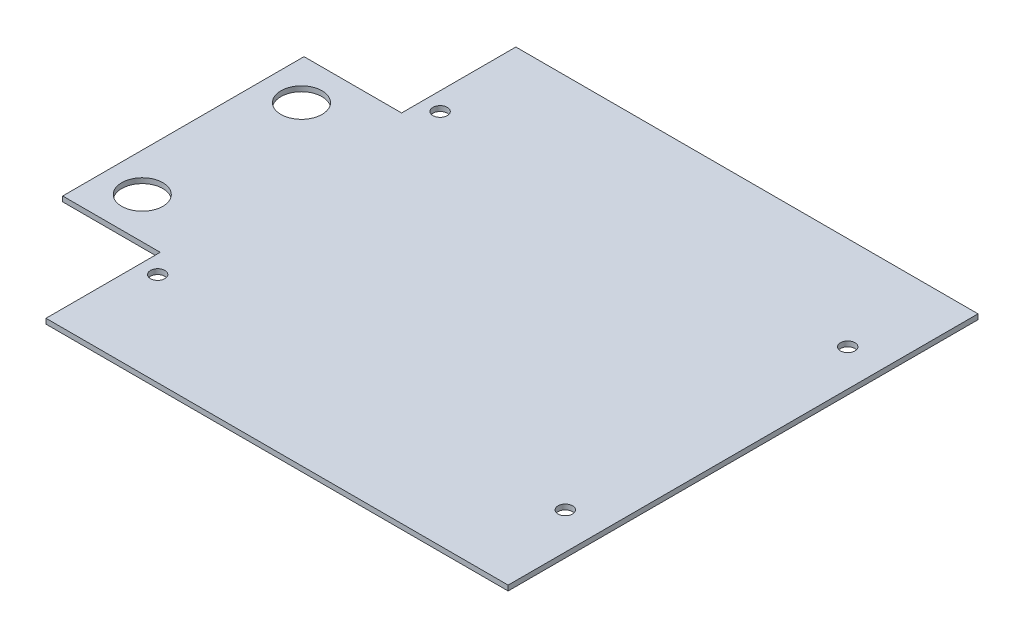
ISO-10303-21;
HEADER;
FILE_DESCRIPTION(('STEP AP214'),'2;1');
FILE_NAME('part.step','',(''),(''),'','','');
FILE_SCHEMA(('AUTOMOTIVE_DESIGN { 1 0 10303 214 1 1 1 1 }'));
ENDSEC;
DATA;
#1=APPLICATION_CONTEXT('core data for automotive mechanical design processes');
#2=APPLICATION_PROTOCOL_DEFINITION('international standard','automotive_design',2000,#1);
#3=PRODUCT_CONTEXT('',#1,'mechanical');
#4=PRODUCT('Part','Part','',(#3));
#5=PRODUCT_RELATED_PRODUCT_CATEGORY('part','',(#4));
#6=PRODUCT_DEFINITION_FORMATION('','',#4);
#7=PRODUCT_DEFINITION_CONTEXT('part definition',#1,'design');
#8=PRODUCT_DEFINITION('design','',#6,#7);
#9=PRODUCT_DEFINITION_SHAPE('','',#8);
#10=(LENGTH_UNIT() NAMED_UNIT(*) SI_UNIT(.MILLI.,.METRE.));
#11=(NAMED_UNIT(*) PLANE_ANGLE_UNIT() SI_UNIT($,.RADIAN.));
#12=(NAMED_UNIT(*) SI_UNIT($,.STERADIAN.) SOLID_ANGLE_UNIT());
#13=UNCERTAINTY_MEASURE_WITH_UNIT(LENGTH_MEASURE(1.E-05),#10,'distance_accuracy_value','');
#14=(GEOMETRIC_REPRESENTATION_CONTEXT(3) GLOBAL_UNCERTAINTY_ASSIGNED_CONTEXT((#13)) GLOBAL_UNIT_ASSIGNED_CONTEXT((#10,
#11,#12)) REPRESENTATION_CONTEXT('',''));
#15=CARTESIAN_POINT('',(0.,0.,0.));
#16=DIRECTION('',(0.,0.,1.));
#17=DIRECTION('',(1.,0.,0.));
#18=AXIS2_PLACEMENT_3D('',#15,#16,#17);
#19=CARTESIAN_POINT('',(90.,-2.,-91.5));
#20=DIRECTION('',(1.,0.,0.));
#21=DIRECTION('',(0.,0.,-1.));
#22=AXIS2_PLACEMENT_3D('',#19,#20,#21);
#23=PLANE('',#22);
#24=DIRECTION('',(0.,0.,-1.));
#25=VECTOR('',#24,1.);
#26=CARTESIAN_POINT('',(90.,0.,-91.5));
#27=LINE('',#26,#25);
#28=CARTESIAN_POINT('',(90.,0.,91.5));
#29=VERTEX_POINT('',#28);
#30=CARTESIAN_POINT('',(90.,0.,-91.5));
#31=VERTEX_POINT('',#30);
#32=EDGE_CURVE('E140',#29,#31,#27,.T.);
#33=ORIENTED_EDGE('',*,*,#32,.F.);
#34=DIRECTION('',(0.,1.,0.));
#35=VECTOR('',#34,1.);
#36=CARTESIAN_POINT('',(90.,-2.,91.5));
#37=LINE('',#36,#35);
#38=CARTESIAN_POINT('',(90.,-2.,91.5));
#39=VERTEX_POINT('',#38);
#40=EDGE_CURVE('E11',#39,#29,#37,.T.);
#41=ORIENTED_EDGE('',*,*,#40,.F.);
#42=DIRECTION('',(0.,0.,-1.));
#43=VECTOR('',#42,1.);
#44=CARTESIAN_POINT('',(90.,-2.,-91.5));
#45=LINE('',#44,#43);
#46=CARTESIAN_POINT('',(90.,-2.,-91.5));
#47=VERTEX_POINT('',#46);
#48=EDGE_CURVE('E161',#39,#47,#45,.T.);
#49=ORIENTED_EDGE('',*,*,#48,.T.);
#50=DIRECTION('',(0.,1.,0.));
#51=VECTOR('',#50,1.);
#52=CARTESIAN_POINT('',(90.,-2.,-91.5));
#53=LINE('',#52,#51);
#54=EDGE_CURVE('E46',#47,#31,#53,.T.);
#55=ORIENTED_EDGE('',*,*,#54,.T.);
#56=EDGE_LOOP('',(#33,#41,#49,#55));
#57=FACE_BOUND('',#56,.T.);
#58=ADVANCED_FACE('F43',(#57),#23,.T.);
#59=CARTESIAN_POINT('',(-90.,-2.,91.5));
#60=DIRECTION('',(0.,0.,1.));
#61=DIRECTION('',(1.,0.,0.));
#62=AXIS2_PLACEMENT_3D('',#59,#60,#61);
#63=PLANE('',#62);
#64=DIRECTION('',(1.,0.,0.));
#65=VECTOR('',#64,1.);
#66=CARTESIAN_POINT('',(-90.,0.,91.5));
#67=LINE('',#66,#65);
#68=CARTESIAN_POINT('',(-90.,0.,91.5));
#69=VERTEX_POINT('',#68);
#70=EDGE_CURVE('E159',#69,#29,#67,.T.);
#71=ORIENTED_EDGE('',*,*,#70,.F.);
#72=DIRECTION('',(0.,1.,0.));
#73=VECTOR('',#72,1.);
#74=CARTESIAN_POINT('',(-90.,-2.,91.5));
#75=LINE('',#74,#73);
#76=CARTESIAN_POINT('',(-90.,-2.,91.5));
#77=VERTEX_POINT('',#76);
#78=EDGE_CURVE('E52',#77,#69,#75,.T.);
#79=ORIENTED_EDGE('',*,*,#78,.F.);
#80=DIRECTION('',(1.,0.,0.));
#81=VECTOR('',#80,1.);
#82=CARTESIAN_POINT('',(-90.,-2.,91.5));
#83=LINE('',#82,#81);
#84=EDGE_CURVE('E130',#77,#39,#83,.T.);
#85=ORIENTED_EDGE('',*,*,#84,.T.);
#86=ORIENTED_EDGE('',*,*,#40,.T.);
#87=EDGE_LOOP('',(#71,#79,#85,#86));
#88=FACE_BOUND('',#87,.T.);
#89=ADVANCED_FACE('F173',(#88),#63,.T.);
#90=CARTESIAN_POINT('',(-90.,-2.,47.));
#91=DIRECTION('',(-1.,0.,0.));
#92=DIRECTION('',(0.,0.,1.));
#93=AXIS2_PLACEMENT_3D('',#90,#91,#92);
#94=PLANE('',#93);
#95=DIRECTION('',(0.,0.,1.));
#96=VECTOR('',#95,1.);
#97=CARTESIAN_POINT('',(-90.,0.,47.));
#98=LINE('',#97,#96);
#99=CARTESIAN_POINT('',(-90.,0.,47.));
#100=VERTEX_POINT('',#99);
#101=EDGE_CURVE('E117',#100,#69,#98,.T.);
#102=ORIENTED_EDGE('',*,*,#101,.F.);
#103=DIRECTION('',(0.,1.,0.));
#104=VECTOR('',#103,1.);
#105=CARTESIAN_POINT('',(-90.,-2.,47.));
#106=LINE('',#105,#104);
#107=CARTESIAN_POINT('',(-90.,-2.,47.));
#108=VERTEX_POINT('',#107);
#109=EDGE_CURVE('E112',#108,#100,#106,.T.);
#110=ORIENTED_EDGE('',*,*,#109,.F.);
#111=DIRECTION('',(0.,0.,1.));
#112=VECTOR('',#111,1.);
#113=CARTESIAN_POINT('',(-90.,-2.,47.));
#114=LINE('',#113,#112);
#115=EDGE_CURVE('E115',#108,#77,#114,.T.);
#116=ORIENTED_EDGE('',*,*,#115,.T.);
#117=ORIENTED_EDGE('',*,*,#78,.T.);
#118=EDGE_LOOP('',(#102,#110,#116,#117));
#119=FACE_BOUND('',#118,.T.);
#120=ADVANCED_FACE('F114',(#119),#94,.T.);
#121=CARTESIAN_POINT('',(-128.,-2.,47.));
#122=DIRECTION('',(0.,0.,1.));
#123=DIRECTION('',(1.,0.,0.));
#124=AXIS2_PLACEMENT_3D('',#121,#122,#123);
#125=PLANE('',#124);
#126=DIRECTION('',(1.,0.,0.));
#127=VECTOR('',#126,1.);
#128=CARTESIAN_POINT('',(-128.,0.,47.));
#129=LINE('',#128,#127);
#130=CARTESIAN_POINT('',(-128.,0.,47.));
#131=VERTEX_POINT('',#130);
#132=EDGE_CURVE('E156',#131,#100,#129,.T.);
#133=ORIENTED_EDGE('',*,*,#132,.F.);
#134=DIRECTION('',(0.,1.,0.));
#135=VECTOR('',#134,1.);
#136=CARTESIAN_POINT('',(-128.,-2.,47.));
#137=LINE('',#136,#135);
#138=CARTESIAN_POINT('',(-128.,-2.,47.));
#139=VERTEX_POINT('',#138);
#140=EDGE_CURVE('E122',#139,#131,#137,.T.);
#141=ORIENTED_EDGE('',*,*,#140,.F.);
#142=DIRECTION('',(1.,0.,0.));
#143=VECTOR('',#142,1.);
#144=CARTESIAN_POINT('',(-128.,-2.,47.));
#145=LINE('',#144,#143);
#146=EDGE_CURVE('E128',#139,#108,#145,.T.);
#147=ORIENTED_EDGE('',*,*,#146,.T.);
#148=ORIENTED_EDGE('',*,*,#109,.T.);
#149=EDGE_LOOP('',(#133,#141,#147,#148));
#150=FACE_BOUND('',#149,.T.);
#151=ADVANCED_FACE('F132',(#150),#125,.T.);
#152=CARTESIAN_POINT('',(-128.,-2.,-47.));
#153=DIRECTION('',(-1.,0.,0.));
#154=DIRECTION('',(0.,0.,1.));
#155=AXIS2_PLACEMENT_3D('',#152,#153,#154);
#156=PLANE('',#155);
#157=DIRECTION('',(0.,0.,1.));
#158=VECTOR('',#157,1.);
#159=CARTESIAN_POINT('',(-128.,0.,-47.));
#160=LINE('',#159,#158);
#161=CARTESIAN_POINT('',(-128.,0.,-47.));
#162=VERTEX_POINT('',#161);
#163=EDGE_CURVE('E153',#162,#131,#160,.T.);
#164=ORIENTED_EDGE('',*,*,#163,.F.);
#165=DIRECTION('',(0.,1.,0.));
#166=VECTOR('',#165,1.);
#167=CARTESIAN_POINT('',(-128.,-2.,-47.));
#168=LINE('',#167,#166);
#169=CARTESIAN_POINT('',(-128.,-2.,-47.));
#170=VERTEX_POINT('',#169);
#171=EDGE_CURVE('E165',#170,#162,#168,.T.);
#172=ORIENTED_EDGE('',*,*,#171,.F.);
#173=DIRECTION('',(0.,0.,1.));
#174=VECTOR('',#173,1.);
#175=CARTESIAN_POINT('',(-128.,-2.,-47.));
#176=LINE('',#175,#174);
#177=EDGE_CURVE('E133',#170,#139,#176,.T.);
#178=ORIENTED_EDGE('',*,*,#177,.T.);
#179=ORIENTED_EDGE('',*,*,#140,.T.);
#180=EDGE_LOOP('',(#164,#172,#178,#179));
#181=FACE_BOUND('',#180,.T.);
#182=ADVANCED_FACE('F186',(#181),#156,.T.);
#183=CARTESIAN_POINT('',(-90.,-2.,-47.));
#184=DIRECTION('',(0.,0.,-1.));
#185=DIRECTION('',(-1.,0.,0.));
#186=AXIS2_PLACEMENT_3D('',#183,#184,#185);
#187=PLANE('',#186);
#188=DIRECTION('',(-1.,0.,0.));
#189=VECTOR('',#188,1.);
#190=CARTESIAN_POINT('',(-90.,0.,-47.));
#191=LINE('',#190,#189);
#192=CARTESIAN_POINT('',(-90.,0.,-47.));
#193=VERTEX_POINT('',#192);
#194=EDGE_CURVE('E150',#193,#162,#191,.T.);
#195=ORIENTED_EDGE('',*,*,#194,.F.);
#196=DIRECTION('',(0.,1.,0.));
#197=VECTOR('',#196,1.);
#198=CARTESIAN_POINT('',(-90.,-2.,-47.));
#199=LINE('',#198,#197);
#200=CARTESIAN_POINT('',(-90.,-2.,-47.));
#201=VERTEX_POINT('',#200);
#202=EDGE_CURVE('E167',#201,#193,#199,.T.);
#203=ORIENTED_EDGE('',*,*,#202,.F.);
#204=DIRECTION('',(-1.,0.,0.));
#205=VECTOR('',#204,1.);
#206=CARTESIAN_POINT('',(-90.,-2.,-47.));
#207=LINE('',#206,#205);
#208=EDGE_CURVE('E135',#201,#170,#207,.T.);
#209=ORIENTED_EDGE('',*,*,#208,.T.);
#210=ORIENTED_EDGE('',*,*,#171,.T.);
#211=EDGE_LOOP('',(#195,#203,#209,#210));
#212=FACE_BOUND('',#211,.T.);
#213=ADVANCED_FACE('F189',(#212),#187,.T.);
#214=CARTESIAN_POINT('',(-90.,-2.,-91.5));
#215=DIRECTION('',(-1.,0.,0.));
#216=DIRECTION('',(0.,0.,1.));
#217=AXIS2_PLACEMENT_3D('',#214,#215,#216);
#218=PLANE('',#217);
#219=DIRECTION('',(0.,0.,1.));
#220=VECTOR('',#219,1.);
#221=CARTESIAN_POINT('',(-90.,0.,-91.5));
#222=LINE('',#221,#220);
#223=CARTESIAN_POINT('',(-90.,0.,-91.5));
#224=VERTEX_POINT('',#223);
#225=EDGE_CURVE('E147',#224,#193,#222,.T.);
#226=ORIENTED_EDGE('',*,*,#225,.F.);
#227=DIRECTION('',(0.,1.,0.));
#228=VECTOR('',#227,1.);
#229=CARTESIAN_POINT('',(-90.,-2.,-91.5));
#230=LINE('',#229,#228);
#231=CARTESIAN_POINT('',(-90.,-2.,-91.5));
#232=VERTEX_POINT('',#231);
#233=EDGE_CURVE('E168',#232,#224,#230,.T.);
#234=ORIENTED_EDGE('',*,*,#233,.F.);
#235=DIRECTION('',(0.,0.,1.));
#236=VECTOR('',#235,1.);
#237=CARTESIAN_POINT('',(-90.,-2.,-91.5));
#238=LINE('',#237,#236);
#239=EDGE_CURVE('E275',#232,#201,#238,.T.);
#240=ORIENTED_EDGE('',*,*,#239,.T.);
#241=ORIENTED_EDGE('',*,*,#202,.T.);
#242=EDGE_LOOP('',(#226,#234,#240,#241));
#243=FACE_BOUND('',#242,.T.);
#244=ADVANCED_FACE('F193',(#243),#218,.T.);
#245=CARTESIAN_POINT('',(-90.,-2.,-91.5));
#246=DIRECTION('',(0.,0.,-1.));
#247=DIRECTION('',(-1.,0.,0.));
#248=AXIS2_PLACEMENT_3D('',#245,#246,#247);
#249=PLANE('',#248);
#250=DIRECTION('',(-1.,0.,0.));
#251=VECTOR('',#250,1.);
#252=CARTESIAN_POINT('',(-90.,0.,-91.5));
#253=LINE('',#252,#251);
#254=EDGE_CURVE('E143',#31,#224,#253,.T.);
#255=ORIENTED_EDGE('',*,*,#254,.F.);
#256=ORIENTED_EDGE('',*,*,#54,.F.);
#257=DIRECTION('',(-1.,0.,0.));
#258=VECTOR('',#257,1.);
#259=CARTESIAN_POINT('',(-90.,-2.,-91.5));
#260=LINE('',#259,#258);
#261=EDGE_CURVE('E273',#47,#232,#260,.T.);
#262=ORIENTED_EDGE('',*,*,#261,.T.);
#263=ORIENTED_EDGE('',*,*,#233,.T.);
#264=EDGE_LOOP('',(#255,#256,#262,#263));
#265=FACE_BOUND('',#264,.T.);
#266=ADVANCED_FACE('F170',(#265),#249,.T.);
#267=CARTESIAN_POINT('',(0.,-2.,0.));
#268=DIRECTION('',(0.,1.,0.));
#269=DIRECTION('',(0.,0.,1.));
#270=AXIS2_PLACEMENT_3D('',#267,#268,#269);
#271=PLANE('',#270);
#272=CARTESIAN_POINT('',(-113.,-2.,31.));
#273=DIRECTION('',(0.,1.,0.));
#274=DIRECTION('',(0.,0.,1.));
#275=AXIS2_PLACEMENT_3D('',#272,#273,#274);
#276=CIRCLE('',#275,8.00000000000001);
#277=CARTESIAN_POINT('',(-113.,-2.,39.));
#278=VERTEX_POINT('',#277);
#279=EDGE_CURVE('E236',#278,#278,#276,.T.);
#280=ORIENTED_EDGE('',*,*,#279,.T.);
#281=EDGE_LOOP('',(#280));
#282=FACE_BOUND('',#281,.T.);
#283=CARTESIAN_POINT('',(-113.,-2.,-31.));
#284=DIRECTION('',(0.,1.,0.));
#285=DIRECTION('',(0.,0.,1.));
#286=AXIS2_PLACEMENT_3D('',#283,#284,#285);
#287=CIRCLE('',#286,8.00000000000001);
#288=CARTESIAN_POINT('',(-113.,-2.,-23.));
#289=VERTEX_POINT('',#288);
#290=EDGE_CURVE('E244',#289,#289,#287,.T.);
#291=ORIENTED_EDGE('',*,*,#290,.T.);
#292=EDGE_LOOP('',(#291));
#293=FACE_BOUND('',#292,.T.);
#294=CARTESIAN_POINT('',(75.76,-2.,-55.0037));
#295=DIRECTION('',(0.,1.,0.));
#296=DIRECTION('',(0.,0.,1.));
#297=AXIS2_PLACEMENT_3D('',#294,#295,#296);
#298=CIRCLE('',#297,2.79999999999999);
#299=CARTESIAN_POINT('',(75.76,-2.,-52.2037));
#300=VERTEX_POINT('',#299);
#301=EDGE_CURVE('E250',#300,#300,#298,.T.);
#302=ORIENTED_EDGE('',*,*,#301,.T.);
#303=EDGE_LOOP('',(#302));
#304=FACE_BOUND('',#303,.T.);
#305=CARTESIAN_POINT('',(75.76,-2.,55.0037));
#306=DIRECTION('',(0.,1.,0.));
#307=DIRECTION('',(0.,0.,1.));
#308=AXIS2_PLACEMENT_3D('',#305,#306,#307);
#309=CIRCLE('',#308,2.79999999999999);
#310=CARTESIAN_POINT('',(75.76,-2.,57.8037));
#311=VERTEX_POINT('',#310);
#312=EDGE_CURVE('E256',#311,#311,#309,.T.);
#313=ORIENTED_EDGE('',*,*,#312,.T.);
#314=EDGE_LOOP('',(#313));
#315=FACE_BOUND('',#314,.T.);
#316=CARTESIAN_POINT('',(-83.,-2.,55.0037));
#317=DIRECTION('',(0.,1.,0.));
#318=DIRECTION('',(0.,0.,1.));
#319=AXIS2_PLACEMENT_3D('',#316,#317,#318);
#320=CIRCLE('',#319,2.79999999999999);
#321=CARTESIAN_POINT('',(-83.,-2.,57.8037));
#322=VERTEX_POINT('',#321);
#323=EDGE_CURVE('E262',#322,#322,#320,.T.);
#324=ORIENTED_EDGE('',*,*,#323,.T.);
#325=EDGE_LOOP('',(#324));
#326=FACE_BOUND('',#325,.T.);
#327=CARTESIAN_POINT('',(-83.,-2.,-55.0037));
#328=DIRECTION('',(0.,1.,0.));
#329=DIRECTION('',(0.,0.,1.));
#330=AXIS2_PLACEMENT_3D('',#327,#328,#329);
#331=CIRCLE('',#330,2.79999999999999);
#332=CARTESIAN_POINT('',(-83.,-2.,-52.2037));
#333=VERTEX_POINT('',#332);
#334=EDGE_CURVE('E144',#333,#333,#331,.T.);
#335=ORIENTED_EDGE('',*,*,#334,.T.);
#336=EDGE_LOOP('',(#335));
#337=FACE_BOUND('',#336,.T.);
#338=ORIENTED_EDGE('',*,*,#48,.F.);
#339=ORIENTED_EDGE('',*,*,#84,.F.);
#340=ORIENTED_EDGE('',*,*,#115,.F.);
#341=ORIENTED_EDGE('',*,*,#146,.F.);
#342=ORIENTED_EDGE('',*,*,#177,.F.);
#343=ORIENTED_EDGE('',*,*,#208,.F.);
#344=ORIENTED_EDGE('',*,*,#239,.F.);
#345=ORIENTED_EDGE('',*,*,#261,.F.);
#346=EDGE_LOOP('',(#338,#339,#340,#341,#342,#343,#344,#345));
#347=FACE_BOUND('',#346,.T.);
#348=ADVANCED_FACE('F126',(#282,#293,#304,#315,#326,#337,#347),#271,.F.);
#349=CARTESIAN_POINT('',(0.,0.,0.));
#350=DIRECTION('',(0.,1.,0.));
#351=DIRECTION('',(0.,0.,1.));
#352=AXIS2_PLACEMENT_3D('',#349,#350,#351);
#353=PLANE('',#352);
#354=CARTESIAN_POINT('',(-113.,0.,31.));
#355=DIRECTION('',(0.,1.,0.));
#356=DIRECTION('',(0.,0.,1.));
#357=AXIS2_PLACEMENT_3D('',#354,#355,#356);
#358=CIRCLE('',#357,8.00000000000001);
#359=CARTESIAN_POINT('',(-113.,0.,39.));
#360=VERTEX_POINT('',#359);
#361=EDGE_CURVE('E239',#360,#360,#358,.T.);
#362=ORIENTED_EDGE('',*,*,#361,.F.);
#363=EDGE_LOOP('',(#362));
#364=FACE_BOUND('',#363,.T.);
#365=CARTESIAN_POINT('',(-113.,0.,-31.));
#366=DIRECTION('',(0.,1.,0.));
#367=DIRECTION('',(0.,0.,1.));
#368=AXIS2_PLACEMENT_3D('',#365,#366,#367);
#369=CIRCLE('',#368,8.00000000000001);
#370=CARTESIAN_POINT('',(-113.,0.,-23.));
#371=VERTEX_POINT('',#370);
#372=EDGE_CURVE('E241',#371,#371,#369,.T.);
#373=ORIENTED_EDGE('',*,*,#372,.F.);
#374=EDGE_LOOP('',(#373));
#375=FACE_BOUND('',#374,.T.);
#376=CARTESIAN_POINT('',(75.76,0.,-55.0037));
#377=DIRECTION('',(0.,1.,0.));
#378=DIRECTION('',(0.,0.,1.));
#379=AXIS2_PLACEMENT_3D('',#376,#377,#378);
#380=CIRCLE('',#379,2.79999999999999);
#381=CARTESIAN_POINT('',(75.76,0.,-52.2037));
#382=VERTEX_POINT('',#381);
#383=EDGE_CURVE('E247',#382,#382,#380,.T.);
#384=ORIENTED_EDGE('',*,*,#383,.F.);
#385=EDGE_LOOP('',(#384));
#386=FACE_BOUND('',#385,.T.);
#387=CARTESIAN_POINT('',(75.76,0.,55.0037));
#388=DIRECTION('',(0.,1.,0.));
#389=DIRECTION('',(0.,0.,1.));
#390=AXIS2_PLACEMENT_3D('',#387,#388,#389);
#391=CIRCLE('',#390,2.79999999999999);
#392=CARTESIAN_POINT('',(75.76,0.,57.8037));
#393=VERTEX_POINT('',#392);
#394=EDGE_CURVE('E253',#393,#393,#391,.T.);
#395=ORIENTED_EDGE('',*,*,#394,.F.);
#396=EDGE_LOOP('',(#395));
#397=FACE_BOUND('',#396,.T.);
#398=CARTESIAN_POINT('',(-83.,0.,55.0037));
#399=DIRECTION('',(0.,1.,0.));
#400=DIRECTION('',(0.,0.,1.));
#401=AXIS2_PLACEMENT_3D('',#398,#399,#400);
#402=CIRCLE('',#401,2.79999999999999);
#403=CARTESIAN_POINT('',(-83.,0.,57.8037));
#404=VERTEX_POINT('',#403);
#405=EDGE_CURVE('E259',#404,#404,#402,.T.);
#406=ORIENTED_EDGE('',*,*,#405,.F.);
#407=EDGE_LOOP('',(#406));
#408=FACE_BOUND('',#407,.T.);
#409=CARTESIAN_POINT('',(-83.,0.,-55.0037));
#410=DIRECTION('',(0.,1.,0.));
#411=DIRECTION('',(0.,0.,1.));
#412=AXIS2_PLACEMENT_3D('',#409,#410,#411);
#413=CIRCLE('',#412,2.79999999999999);
#414=CARTESIAN_POINT('',(-83.,0.,-52.2037));
#415=VERTEX_POINT('',#414);
#416=EDGE_CURVE('E265',#415,#415,#413,.T.);
#417=ORIENTED_EDGE('',*,*,#416,.F.);
#418=EDGE_LOOP('',(#417));
#419=FACE_BOUND('',#418,.T.);
#420=ORIENTED_EDGE('',*,*,#32,.T.);
#421=ORIENTED_EDGE('',*,*,#254,.T.);
#422=ORIENTED_EDGE('',*,*,#225,.T.);
#423=ORIENTED_EDGE('',*,*,#194,.T.);
#424=ORIENTED_EDGE('',*,*,#163,.T.);
#425=ORIENTED_EDGE('',*,*,#132,.T.);
#426=ORIENTED_EDGE('',*,*,#101,.T.);
#427=ORIENTED_EDGE('',*,*,#70,.T.);
#428=EDGE_LOOP('',(#420,#421,#422,#423,#424,#425,#426,#427));
#429=FACE_BOUND('',#428,.T.);
#430=ADVANCED_FACE('F172',(#364,#375,#386,#397,#408,#419,#429),#353,.T.);
#431=CARTESIAN_POINT('',(-83.,-2.,-55.0037));
#432=DIRECTION('',(0.,1.,0.));
#433=DIRECTION('',(0.,0.,1.));
#434=AXIS2_PLACEMENT_3D('',#431,#432,#433);
#435=CYLINDRICAL_SURFACE('',#434,2.79999999999999);
#436=ORIENTED_EDGE('',*,*,#334,.F.);
#437=EDGE_LOOP('',(#436));
#438=FACE_BOUND('',#437,.T.);
#439=ORIENTED_EDGE('',*,*,#416,.T.);
#440=EDGE_LOOP('',(#439));
#441=FACE_BOUND('',#440,.T.);
#442=ADVANCED_FACE('F205',(#438,#441),#435,.F.);
#443=CARTESIAN_POINT('',(-83.,-2.,55.0037));
#444=DIRECTION('',(0.,1.,0.));
#445=DIRECTION('',(0.,0.,1.));
#446=AXIS2_PLACEMENT_3D('',#443,#444,#445);
#447=CYLINDRICAL_SURFACE('',#446,2.79999999999999);
#448=ORIENTED_EDGE('',*,*,#323,.F.);
#449=EDGE_LOOP('',(#448));
#450=FACE_BOUND('',#449,.T.);
#451=ORIENTED_EDGE('',*,*,#405,.T.);
#452=EDGE_LOOP('',(#451));
#453=FACE_BOUND('',#452,.T.);
#454=ADVANCED_FACE('F212',(#450,#453),#447,.F.);
#455=CARTESIAN_POINT('',(75.76,-2.,55.0037));
#456=DIRECTION('',(0.,1.,0.));
#457=DIRECTION('',(0.,0.,1.));
#458=AXIS2_PLACEMENT_3D('',#455,#456,#457);
#459=CYLINDRICAL_SURFACE('',#458,2.79999999999999);
#460=ORIENTED_EDGE('',*,*,#312,.F.);
#461=EDGE_LOOP('',(#460));
#462=FACE_BOUND('',#461,.T.);
#463=ORIENTED_EDGE('',*,*,#394,.T.);
#464=EDGE_LOOP('',(#463));
#465=FACE_BOUND('',#464,.T.);
#466=ADVANCED_FACE('F216',(#462,#465),#459,.F.);
#467=CARTESIAN_POINT('',(75.76,-2.,-55.0037));
#468=DIRECTION('',(0.,1.,0.));
#469=DIRECTION('',(0.,0.,1.));
#470=AXIS2_PLACEMENT_3D('',#467,#468,#469);
#471=CYLINDRICAL_SURFACE('',#470,2.79999999999999);
#472=ORIENTED_EDGE('',*,*,#301,.F.);
#473=EDGE_LOOP('',(#472));
#474=FACE_BOUND('',#473,.T.);
#475=ORIENTED_EDGE('',*,*,#383,.T.);
#476=EDGE_LOOP('',(#475));
#477=FACE_BOUND('',#476,.T.);
#478=ADVANCED_FACE('F220',(#474,#477),#471,.F.);
#479=CARTESIAN_POINT('',(-113.,-2.,-31.));
#480=DIRECTION('',(0.,1.,0.));
#481=DIRECTION('',(0.,0.,1.));
#482=AXIS2_PLACEMENT_3D('',#479,#480,#481);
#483=CYLINDRICAL_SURFACE('',#482,8.00000000000001);
#484=ORIENTED_EDGE('',*,*,#290,.F.);
#485=EDGE_LOOP('',(#484));
#486=FACE_BOUND('',#485,.T.);
#487=ORIENTED_EDGE('',*,*,#372,.T.);
#488=EDGE_LOOP('',(#487));
#489=FACE_BOUND('',#488,.T.);
#490=ADVANCED_FACE('F224',(#486,#489),#483,.F.);
#491=CARTESIAN_POINT('',(-113.,-2.,31.));
#492=DIRECTION('',(0.,1.,0.));
#493=DIRECTION('',(0.,0.,1.));
#494=AXIS2_PLACEMENT_3D('',#491,#492,#493);
#495=CYLINDRICAL_SURFACE('',#494,8.00000000000001);
#496=ORIENTED_EDGE('',*,*,#279,.F.);
#497=EDGE_LOOP('',(#496));
#498=FACE_BOUND('',#497,.T.);
#499=ORIENTED_EDGE('',*,*,#361,.T.);
#500=EDGE_LOOP('',(#499));
#501=FACE_BOUND('',#500,.T.);
#502=ADVANCED_FACE('F228',(#498,#501),#495,.F.);
#503=CLOSED_SHELL('',(#58,#89,#120,#151,#182,#213,#244,#266,#348,#430,#442,#454,#466,#478,#490,#502));
#504=MANIFOLD_SOLID_BREP('B2',#503);
#505=ADVANCED_BREP_SHAPE_REPRESENTATION('',(#18,#504),#14);
#506=SHAPE_DEFINITION_REPRESENTATION(#9,#505);
ENDSEC;
END-ISO-10303-21;
